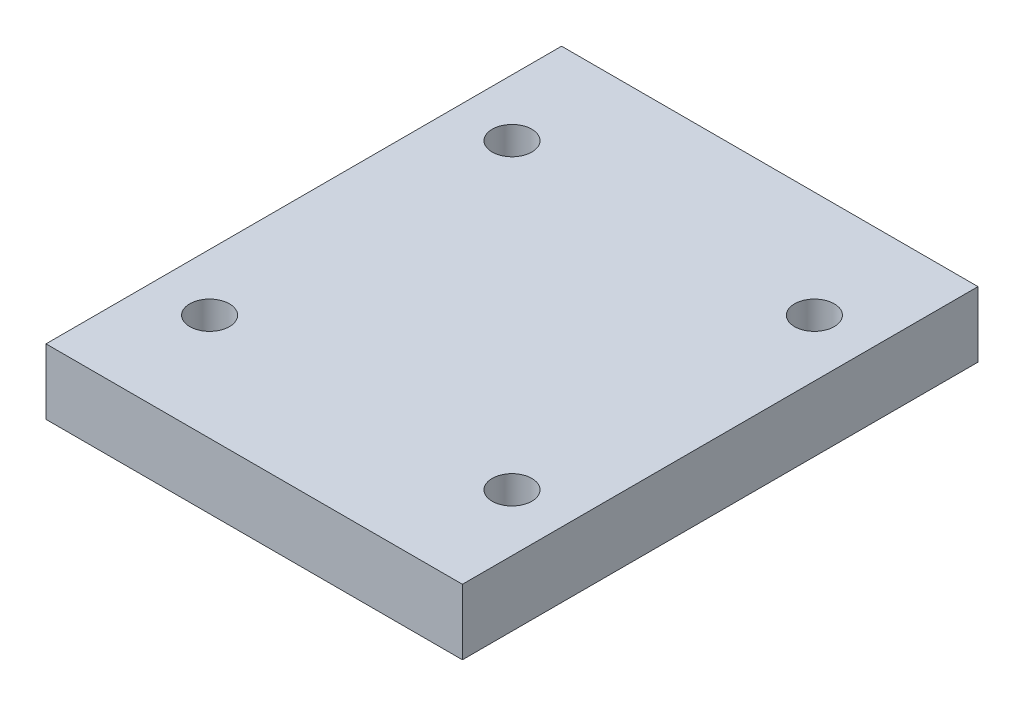
ISO-10303-21;
HEADER;
FILE_DESCRIPTION(('STEP AP214'),'2;1');
FILE_NAME('part.step','',(''),(''),'','','');
FILE_SCHEMA(('AUTOMOTIVE_DESIGN { 1 0 10303 214 1 1 1 1 }'));
ENDSEC;
DATA;
#1=APPLICATION_CONTEXT('core data for automotive mechanical design processes');
#2=APPLICATION_PROTOCOL_DEFINITION('international standard','automotive_design',2000,#1);
#3=PRODUCT_CONTEXT('',#1,'mechanical');
#4=PRODUCT('Part','Part','',(#3));
#5=PRODUCT_RELATED_PRODUCT_CATEGORY('part','',(#4));
#6=PRODUCT_DEFINITION_FORMATION('','',#4);
#7=PRODUCT_DEFINITION_CONTEXT('part definition',#1,'design');
#8=PRODUCT_DEFINITION('design','',#6,#7);
#9=PRODUCT_DEFINITION_SHAPE('','',#8);
#10=(LENGTH_UNIT() NAMED_UNIT(*) SI_UNIT(.MILLI.,.METRE.));
#11=(NAMED_UNIT(*) PLANE_ANGLE_UNIT() SI_UNIT($,.RADIAN.));
#12=(NAMED_UNIT(*) SI_UNIT($,.STERADIAN.) SOLID_ANGLE_UNIT());
#13=UNCERTAINTY_MEASURE_WITH_UNIT(LENGTH_MEASURE(1.E-05),#10,'distance_accuracy_value','');
#14=(GEOMETRIC_REPRESENTATION_CONTEXT(3) GLOBAL_UNCERTAINTY_ASSIGNED_CONTEXT((#13)) GLOBAL_UNIT_ASSIGNED_CONTEXT((#10,
#11,#12)) REPRESENTATION_CONTEXT('',''));
#15=CARTESIAN_POINT('',(0.,0.,0.));
#16=DIRECTION('',(0.,0.,1.));
#17=DIRECTION('',(1.,0.,0.));
#18=AXIS2_PLACEMENT_3D('',#15,#16,#17);
#19=CARTESIAN_POINT('',(-21.,6.6,26.));
#20=DIRECTION('',(1.,0.,0.));
#21=DIRECTION('',(0.,0.,-1.));
#22=AXIS2_PLACEMENT_3D('',#19,#20,#21);
#23=PLANE('',#22);
#24=DIRECTION('',(0.,0.,1.));
#25=VECTOR('',#24,1.);
#26=CARTESIAN_POINT('',(-21.,0.,26.));
#27=LINE('',#26,#25);
#28=CARTESIAN_POINT('',(-21.,0.,-26.));
#29=VERTEX_POINT('',#28);
#30=CARTESIAN_POINT('',(-21.,0.,26.));
#31=VERTEX_POINT('',#30);
#32=EDGE_CURVE('E106',#29,#31,#27,.T.);
#33=ORIENTED_EDGE('',*,*,#32,.T.);
#34=DIRECTION('',(0.,-1.,0.));
#35=VECTOR('',#34,1.);
#36=CARTESIAN_POINT('',(-21.,6.6,26.));
#37=LINE('',#36,#35);
#38=CARTESIAN_POINT('',(-21.,6.6,26.));
#39=VERTEX_POINT('',#38);
#40=EDGE_CURVE('E11',#39,#31,#37,.T.);
#41=ORIENTED_EDGE('',*,*,#40,.F.);
#42=DIRECTION('',(0.,0.,1.));
#43=VECTOR('',#42,1.);
#44=CARTESIAN_POINT('',(-21.,6.6,26.));
#45=LINE('',#44,#43);
#46=CARTESIAN_POINT('',(-21.,6.6,-26.));
#47=VERTEX_POINT('',#46);
#48=EDGE_CURVE('E94',#47,#39,#45,.T.);
#49=ORIENTED_EDGE('',*,*,#48,.F.);
#50=DIRECTION('',(0.,-1.,0.));
#51=VECTOR('',#50,1.);
#52=CARTESIAN_POINT('',(-21.,6.6,-26.));
#53=LINE('',#52,#51);
#54=EDGE_CURVE('E105',#47,#29,#53,.T.);
#55=ORIENTED_EDGE('',*,*,#54,.T.);
#56=EDGE_LOOP('',(#33,#41,#49,#55));
#57=FACE_BOUND('',#56,.T.);
#58=ADVANCED_FACE('F43',(#57),#23,.F.);
#59=CARTESIAN_POINT('',(21.,6.6,26.));
#60=DIRECTION('',(0.,0.,-1.));
#61=DIRECTION('',(-1.,0.,0.));
#62=AXIS2_PLACEMENT_3D('',#59,#60,#61);
#63=PLANE('',#62);
#64=DIRECTION('',(1.,0.,0.));
#65=VECTOR('',#64,1.);
#66=CARTESIAN_POINT('',(21.,0.,26.));
#67=LINE('',#66,#65);
#68=CARTESIAN_POINT('',(21.,0.,26.));
#69=VERTEX_POINT('',#68);
#70=EDGE_CURVE('E98',#31,#69,#67,.T.);
#71=ORIENTED_EDGE('',*,*,#70,.T.);
#72=DIRECTION('',(0.,-1.,0.));
#73=VECTOR('',#72,1.);
#74=CARTESIAN_POINT('',(21.,6.6,26.));
#75=LINE('',#74,#73);
#76=CARTESIAN_POINT('',(21.,6.6,26.));
#77=VERTEX_POINT('',#76);
#78=EDGE_CURVE('E51',#77,#69,#75,.T.);
#79=ORIENTED_EDGE('',*,*,#78,.F.);
#80=DIRECTION('',(1.,0.,0.));
#81=VECTOR('',#80,1.);
#82=CARTESIAN_POINT('',(21.,6.6,26.));
#83=LINE('',#82,#81);
#84=EDGE_CURVE('E90',#39,#77,#83,.T.);
#85=ORIENTED_EDGE('',*,*,#84,.F.);
#86=ORIENTED_EDGE('',*,*,#40,.T.);
#87=EDGE_LOOP('',(#71,#79,#85,#86));
#88=FACE_BOUND('',#87,.T.);
#89=ADVANCED_FACE('F100',(#88),#63,.F.);
#90=CARTESIAN_POINT('',(21.,6.6,26.));
#91=DIRECTION('',(-1.,0.,0.));
#92=DIRECTION('',(0.,0.,1.));
#93=AXIS2_PLACEMENT_3D('',#90,#91,#92);
#94=PLANE('',#93);
#95=DIRECTION('',(0.,0.,-1.));
#96=VECTOR('',#95,1.);
#97=CARTESIAN_POINT('',(21.,0.,26.));
#98=LINE('',#97,#96);
#99=CARTESIAN_POINT('',(21.,0.,-26.));
#100=VERTEX_POINT('',#99);
#101=EDGE_CURVE('E79',#69,#100,#98,.T.);
#102=ORIENTED_EDGE('',*,*,#101,.T.);
#103=DIRECTION('',(0.,-1.,0.));
#104=VECTOR('',#103,1.);
#105=CARTESIAN_POINT('',(21.,6.6,-26.));
#106=LINE('',#105,#104);
#107=CARTESIAN_POINT('',(21.,6.6,-26.));
#108=VERTEX_POINT('',#107);
#109=EDGE_CURVE('E97',#108,#100,#106,.T.);
#110=ORIENTED_EDGE('',*,*,#109,.F.);
#111=DIRECTION('',(0.,0.,-1.));
#112=VECTOR('',#111,1.);
#113=CARTESIAN_POINT('',(21.,6.6,26.));
#114=LINE('',#113,#112);
#115=EDGE_CURVE('E95',#77,#108,#114,.T.);
#116=ORIENTED_EDGE('',*,*,#115,.F.);
#117=ORIENTED_EDGE('',*,*,#78,.T.);
#118=EDGE_LOOP('',(#102,#110,#116,#117));
#119=FACE_BOUND('',#118,.T.);
#120=ADVANCED_FACE('F99',(#119),#94,.F.);
#121=CARTESIAN_POINT('',(21.,6.6,-26.));
#122=DIRECTION('',(0.,0.,1.));
#123=DIRECTION('',(1.,0.,0.));
#124=AXIS2_PLACEMENT_3D('',#121,#122,#123);
#125=PLANE('',#124);
#126=DIRECTION('',(-1.,0.,0.));
#127=VECTOR('',#126,1.);
#128=CARTESIAN_POINT('',(21.,0.,-26.));
#129=LINE('',#128,#127);
#130=EDGE_CURVE('E84',#100,#29,#129,.T.);
#131=ORIENTED_EDGE('',*,*,#130,.T.);
#132=ORIENTED_EDGE('',*,*,#54,.F.);
#133=DIRECTION('',(-1.,0.,0.));
#134=VECTOR('',#133,1.);
#135=CARTESIAN_POINT('',(21.,6.6,-26.));
#136=LINE('',#135,#134);
#137=EDGE_CURVE('E56',#108,#47,#136,.T.);
#138=ORIENTED_EDGE('',*,*,#137,.F.);
#139=ORIENTED_EDGE('',*,*,#109,.T.);
#140=EDGE_LOOP('',(#131,#132,#138,#139));
#141=FACE_BOUND('',#140,.T.);
#142=ADVANCED_FACE('F111',(#141),#125,.F.);
#143=CARTESIAN_POINT('',(0.,6.6,0.));
#144=DIRECTION('',(0.,1.,0.));
#145=DIRECTION('',(0.,0.,1.));
#146=AXIS2_PLACEMENT_3D('',#143,#144,#145);
#147=PLANE('',#146);
#148=CARTESIAN_POINT('',(-15.25,6.6,15.25));
#149=DIRECTION('',(0.,1.,0.));
#150=DIRECTION('',(0.,0.,1.));
#151=AXIS2_PLACEMENT_3D('',#148,#149,#150);
#152=CIRCLE('',#151,2.);
#153=CARTESIAN_POINT('',(-15.25,6.6,17.25));
#154=VERTEX_POINT('',#153);
#155=EDGE_CURVE('E129',#154,#154,#152,.T.);
#156=ORIENTED_EDGE('',*,*,#155,.F.);
#157=EDGE_LOOP('',(#156));
#158=FACE_BOUND('',#157,.T.);
#159=CARTESIAN_POINT('',(15.25,6.6,15.25));
#160=DIRECTION('',(0.,1.,0.));
#161=DIRECTION('',(0.,0.,1.));
#162=AXIS2_PLACEMENT_3D('',#159,#160,#161);
#163=CIRCLE('',#162,2.);
#164=CARTESIAN_POINT('',(15.25,6.6,17.25));
#165=VERTEX_POINT('',#164);
#166=EDGE_CURVE('E132',#165,#165,#163,.T.);
#167=ORIENTED_EDGE('',*,*,#166,.F.);
#168=EDGE_LOOP('',(#167));
#169=FACE_BOUND('',#168,.T.);
#170=CARTESIAN_POINT('',(15.25,6.6,-15.25));
#171=DIRECTION('',(0.,1.,0.));
#172=DIRECTION('',(0.,0.,1.));
#173=AXIS2_PLACEMENT_3D('',#170,#171,#172);
#174=CIRCLE('',#173,2.);
#175=CARTESIAN_POINT('',(15.25,6.6,-13.25));
#176=VERTEX_POINT('',#175);
#177=EDGE_CURVE('E122',#176,#176,#174,.T.);
#178=ORIENTED_EDGE('',*,*,#177,.F.);
#179=EDGE_LOOP('',(#178));
#180=FACE_BOUND('',#179,.T.);
#181=CARTESIAN_POINT('',(-15.25,6.6,-15.25));
#182=DIRECTION('',(0.,1.,0.));
#183=DIRECTION('',(0.,0.,1.));
#184=AXIS2_PLACEMENT_3D('',#181,#182,#183);
#185=CIRCLE('',#184,2.);
#186=CARTESIAN_POINT('',(-15.25,6.6,-13.25));
#187=VERTEX_POINT('',#186);
#188=EDGE_CURVE('E117',#187,#187,#185,.T.);
#189=ORIENTED_EDGE('',*,*,#188,.F.);
#190=EDGE_LOOP('',(#189));
#191=FACE_BOUND('',#190,.T.);
#192=ORIENTED_EDGE('',*,*,#48,.T.);
#193=ORIENTED_EDGE('',*,*,#84,.T.);
#194=ORIENTED_EDGE('',*,*,#115,.T.);
#195=ORIENTED_EDGE('',*,*,#137,.T.);
#196=EDGE_LOOP('',(#192,#193,#194,#195));
#197=FACE_BOUND('',#196,.T.);
#198=ADVANCED_FACE('F89',(#158,#169,#180,#191,#197),#147,.T.);
#199=CARTESIAN_POINT('',(0.,0.,0.));
#200=DIRECTION('',(0.,1.,0.));
#201=DIRECTION('',(0.,0.,1.));
#202=AXIS2_PLACEMENT_3D('',#199,#200,#201);
#203=PLANE('',#202);
#204=CARTESIAN_POINT('',(-15.25,0.,15.25));
#205=DIRECTION('',(0.,1.,0.));
#206=DIRECTION('',(0.,0.,1.));
#207=AXIS2_PLACEMENT_3D('',#204,#205,#206);
#208=CIRCLE('',#207,2.);
#209=CARTESIAN_POINT('',(-15.25,0.,17.25));
#210=VERTEX_POINT('',#209);
#211=EDGE_CURVE('E127',#210,#210,#208,.T.);
#212=ORIENTED_EDGE('',*,*,#211,.T.);
#213=EDGE_LOOP('',(#212));
#214=FACE_BOUND('',#213,.T.);
#215=CARTESIAN_POINT('',(15.25,0.,15.25));
#216=DIRECTION('',(0.,1.,0.));
#217=DIRECTION('',(0.,0.,1.));
#218=AXIS2_PLACEMENT_3D('',#215,#216,#217);
#219=CIRCLE('',#218,2.);
#220=CARTESIAN_POINT('',(15.25,0.,17.25));
#221=VERTEX_POINT('',#220);
#222=EDGE_CURVE('E131',#221,#221,#219,.T.);
#223=ORIENTED_EDGE('',*,*,#222,.T.);
#224=EDGE_LOOP('',(#223));
#225=FACE_BOUND('',#224,.T.);
#226=CARTESIAN_POINT('',(15.25,0.,-15.25));
#227=DIRECTION('',(0.,1.,0.));
#228=DIRECTION('',(0.,0.,1.));
#229=AXIS2_PLACEMENT_3D('',#226,#227,#228);
#230=CIRCLE('',#229,2.);
#231=CARTESIAN_POINT('',(15.25,0.,-13.25));
#232=VERTEX_POINT('',#231);
#233=EDGE_CURVE('E137',#232,#232,#230,.T.);
#234=ORIENTED_EDGE('',*,*,#233,.T.);
#235=EDGE_LOOP('',(#234));
#236=FACE_BOUND('',#235,.T.);
#237=CARTESIAN_POINT('',(-15.25,0.,-15.25));
#238=DIRECTION('',(0.,1.,0.));
#239=DIRECTION('',(0.,0.,1.));
#240=AXIS2_PLACEMENT_3D('',#237,#238,#239);
#241=CIRCLE('',#240,2.);
#242=CARTESIAN_POINT('',(-15.25,0.,-13.25));
#243=VERTEX_POINT('',#242);
#244=EDGE_CURVE('E108',#243,#243,#241,.T.);
#245=ORIENTED_EDGE('',*,*,#244,.T.);
#246=EDGE_LOOP('',(#245));
#247=FACE_BOUND('',#246,.T.);
#248=ORIENTED_EDGE('',*,*,#32,.F.);
#249=ORIENTED_EDGE('',*,*,#130,.F.);
#250=ORIENTED_EDGE('',*,*,#101,.F.);
#251=ORIENTED_EDGE('',*,*,#70,.F.);
#252=EDGE_LOOP('',(#248,#249,#250,#251));
#253=FACE_BOUND('',#252,.T.);
#254=ADVANCED_FACE('F116',(#214,#225,#236,#247,#253),#203,.F.);
#255=CARTESIAN_POINT('',(-15.25,0.,-15.25));
#256=DIRECTION('',(0.,1.,0.));
#257=DIRECTION('',(0.,0.,1.));
#258=AXIS2_PLACEMENT_3D('',#255,#256,#257);
#259=CYLINDRICAL_SURFACE('',#258,2.);
#260=ORIENTED_EDGE('',*,*,#244,.F.);
#261=EDGE_LOOP('',(#260));
#262=FACE_BOUND('',#261,.T.);
#263=ORIENTED_EDGE('',*,*,#188,.T.);
#264=EDGE_LOOP('',(#263));
#265=FACE_BOUND('',#264,.T.);
#266=ADVANCED_FACE('F155',(#262,#265),#259,.F.);
#267=CARTESIAN_POINT('',(15.25,0.,-15.25));
#268=DIRECTION('',(0.,1.,0.));
#269=DIRECTION('',(0.,0.,1.));
#270=AXIS2_PLACEMENT_3D('',#267,#268,#269);
#271=CYLINDRICAL_SURFACE('',#270,2.);
#272=ORIENTED_EDGE('',*,*,#233,.F.);
#273=EDGE_LOOP('',(#272));
#274=FACE_BOUND('',#273,.T.);
#275=ORIENTED_EDGE('',*,*,#177,.T.);
#276=EDGE_LOOP('',(#275));
#277=FACE_BOUND('',#276,.T.);
#278=ADVANCED_FACE('F145',(#274,#277),#271,.F.);
#279=CARTESIAN_POINT('',(15.25,0.,15.25));
#280=DIRECTION('',(0.,1.,0.));
#281=DIRECTION('',(0.,0.,1.));
#282=AXIS2_PLACEMENT_3D('',#279,#280,#281);
#283=CYLINDRICAL_SURFACE('',#282,2.);
#284=ORIENTED_EDGE('',*,*,#222,.F.);
#285=EDGE_LOOP('',(#284));
#286=FACE_BOUND('',#285,.T.);
#287=ORIENTED_EDGE('',*,*,#166,.T.);
#288=EDGE_LOOP('',(#287));
#289=FACE_BOUND('',#288,.T.);
#290=ADVANCED_FACE('F159',(#286,#289),#283,.F.);
#291=CARTESIAN_POINT('',(-15.25,0.,15.25));
#292=DIRECTION('',(0.,1.,0.));
#293=DIRECTION('',(0.,0.,1.));
#294=AXIS2_PLACEMENT_3D('',#291,#292,#293);
#295=CYLINDRICAL_SURFACE('',#294,2.);
#296=ORIENTED_EDGE('',*,*,#211,.F.);
#297=EDGE_LOOP('',(#296));
#298=FACE_BOUND('',#297,.T.);
#299=ORIENTED_EDGE('',*,*,#155,.T.);
#300=EDGE_LOOP('',(#299));
#301=FACE_BOUND('',#300,.T.);
#302=ADVANCED_FACE('F211',(#298,#301),#295,.F.);
#303=CLOSED_SHELL('',(#58,#89,#120,#142,#198,#254,#266,#278,#290,#302));
#304=MANIFOLD_SOLID_BREP('B2',#303);
#305=ADVANCED_BREP_SHAPE_REPRESENTATION('',(#18,#304),#14);
#306=SHAPE_DEFINITION_REPRESENTATION(#9,#305);
ENDSEC;
END-ISO-10303-21;
